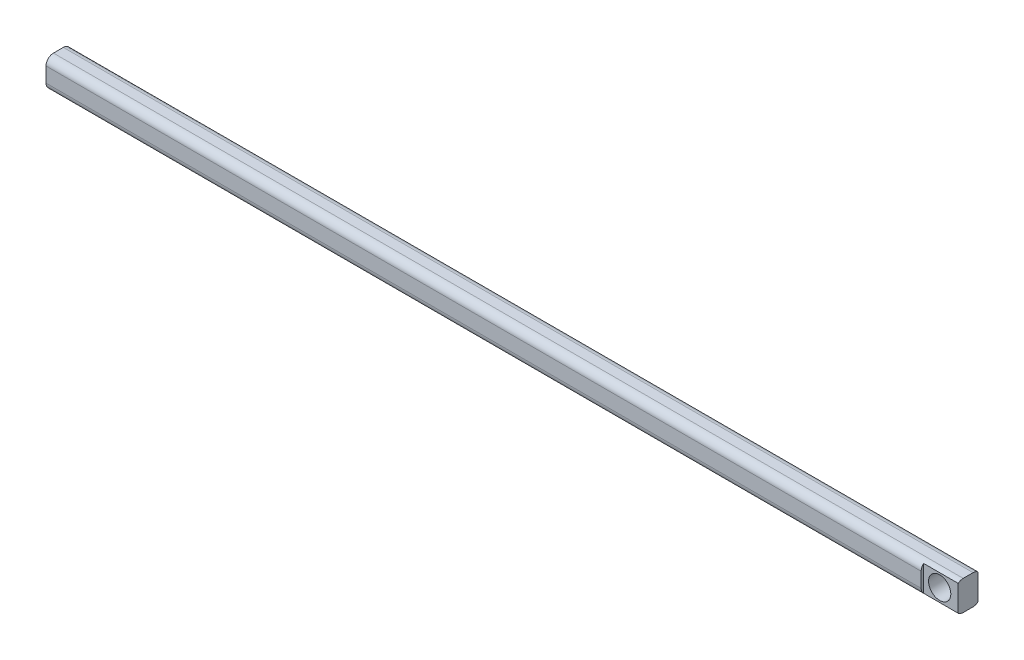
ISO-10303-21;
HEADER;
FILE_DESCRIPTION(('STEP AP214'),'2;1');
FILE_NAME('part.step','',(''),(''),'','','');
FILE_SCHEMA(('AUTOMOTIVE_DESIGN { 1 0 10303 214 1 1 1 1 }'));
ENDSEC;
DATA;
#1=APPLICATION_CONTEXT('core data for automotive mechanical design processes');
#2=APPLICATION_PROTOCOL_DEFINITION('international standard','automotive_design',2000,#1);
#3=PRODUCT_CONTEXT('',#1,'mechanical');
#4=PRODUCT('Part','Part','',(#3));
#5=PRODUCT_RELATED_PRODUCT_CATEGORY('part','',(#4));
#6=PRODUCT_DEFINITION_FORMATION('','',#4);
#7=PRODUCT_DEFINITION_CONTEXT('part definition',#1,'design');
#8=PRODUCT_DEFINITION('design','',#6,#7);
#9=PRODUCT_DEFINITION_SHAPE('','',#8);
#10=(LENGTH_UNIT() NAMED_UNIT(*) SI_UNIT(.MILLI.,.METRE.));
#11=(NAMED_UNIT(*) PLANE_ANGLE_UNIT() SI_UNIT($,.RADIAN.));
#12=(NAMED_UNIT(*) SI_UNIT($,.STERADIAN.) SOLID_ANGLE_UNIT());
#13=UNCERTAINTY_MEASURE_WITH_UNIT(LENGTH_MEASURE(1.E-05),#10,'distance_accuracy_value','');
#14=(GEOMETRIC_REPRESENTATION_CONTEXT(3) GLOBAL_UNCERTAINTY_ASSIGNED_CONTEXT((#13)) GLOBAL_UNIT_ASSIGNED_CONTEXT((#10,
#11,#12)) REPRESENTATION_CONTEXT('',''));
#15=CARTESIAN_POINT('',(0.,0.,0.));
#16=DIRECTION('',(0.,0.,1.));
#17=DIRECTION('',(1.,0.,0.));
#18=AXIS2_PLACEMENT_3D('',#15,#16,#17);
#19=CARTESIAN_POINT('',(0.,0.,12.5));
#20=DIRECTION('',(0.,0.,-1.));
#21=DIRECTION('',(-1.,0.,0.));
#22=AXIS2_PLACEMENT_3D('',#19,#20,#21);
#23=PLANE('',#22);
#24=DIRECTION('',(-1.,0.,0.));
#25=VECTOR('',#24,1.);
#26=CARTESIAN_POINT('',(0.,2.99999999999999,12.5));
#27=LINE('',#26,#25);
#28=CARTESIAN_POINT('',(57.75,2.99999999999999,12.5));
#29=VERTEX_POINT('',#28);
#30=CARTESIAN_POINT('',(-296.25,2.99999999999993,12.5));
#31=VERTEX_POINT('',#30);
#32=EDGE_CURVE('E143',#29,#31,#27,.T.);
#33=ORIENTED_EDGE('',*,*,#32,.T.);
#34=DIRECTION('',(0.,1.,0.));
#35=VECTOR('',#34,1.);
#36=CARTESIAN_POINT('',(-296.25,-3.00000000000007,12.5));
#37=LINE('',#36,#35);
#38=CARTESIAN_POINT('',(-296.25,-3.00000000000007,12.5));
#39=VERTEX_POINT('',#38);
#40=EDGE_CURVE('E146',#39,#31,#37,.T.);
#41=ORIENTED_EDGE('',*,*,#40,.F.);
#42=DIRECTION('',(1.,0.,0.));
#43=VECTOR('',#42,1.);
#44=CARTESIAN_POINT('',(0.,-3.00000000000001,12.5));
#45=LINE('',#44,#43);
#46=CARTESIAN_POINT('',(57.75,-3.,12.5));
#47=VERTEX_POINT('',#46);
#48=EDGE_CURVE('E131',#39,#47,#45,.T.);
#49=ORIENTED_EDGE('',*,*,#48,.T.);
#50=DIRECTION('',(0.,-1.,0.));
#51=VECTOR('',#50,1.);
#52=CARTESIAN_POINT('',(57.75,5.99999999999999,12.5));
#53=LINE('',#52,#51);
#54=EDGE_CURVE('E174',#29,#47,#53,.T.);
#55=ORIENTED_EDGE('',*,*,#54,.F.);
#56=EDGE_LOOP('',(#33,#41,#49,#55));
#57=FACE_BOUND('',#56,.T.);
#58=ADVANCED_FACE('F42',(#57),#23,.F.);
#59=CARTESIAN_POINT('',(0.,0.,2.5));
#60=DIRECTION('',(0.,0.,-1.));
#61=DIRECTION('',(-1.,0.,0.));
#62=AXIS2_PLACEMENT_3D('',#59,#60,#61);
#63=PLANE('',#62);
#64=DIRECTION('',(0.,1.,0.));
#65=VECTOR('',#64,1.);
#66=CARTESIAN_POINT('',(57.75,-6.,2.5));
#67=LINE('',#66,#65);
#68=CARTESIAN_POINT('',(57.75,-3.,2.5));
#69=VERTEX_POINT('',#68);
#70=CARTESIAN_POINT('',(57.75,2.99999999999999,2.5));
#71=VERTEX_POINT('',#70);
#72=EDGE_CURVE('E183',#69,#71,#67,.T.);
#73=ORIENTED_EDGE('',*,*,#72,.F.);
#74=DIRECTION('',(1.,0.,0.));
#75=VECTOR('',#74,1.);
#76=CARTESIAN_POINT('',(53.75,-3.00000000000001,2.5));
#77=LINE('',#76,#75);
#78=CARTESIAN_POINT('',(-296.25,-3.00000000000007,2.5));
#79=VERTEX_POINT('',#78);
#80=EDGE_CURVE('E228',#69,#79,#77,.F.);
#81=ORIENTED_EDGE('',*,*,#80,.T.);
#82=DIRECTION('',(0.,-1.,0.));
#83=VECTOR('',#82,1.);
#84=CARTESIAN_POINT('',(-296.25,2.99999999999993,2.5));
#85=LINE('',#84,#83);
#86=CARTESIAN_POINT('',(-296.25,2.99999999999993,2.5));
#87=VERTEX_POINT('',#86);
#88=EDGE_CURVE('E167',#87,#79,#85,.T.);
#89=ORIENTED_EDGE('',*,*,#88,.F.);
#90=DIRECTION('',(-1.,0.,0.));
#91=VECTOR('',#90,1.);
#92=CARTESIAN_POINT('',(57.75,2.99999999999999,2.5));
#93=LINE('',#92,#91);
#94=EDGE_CURVE('E57',#87,#71,#93,.F.);
#95=ORIENTED_EDGE('',*,*,#94,.T.);
#96=EDGE_LOOP('',(#73,#81,#89,#95));
#97=FACE_BOUND('',#96,.T.);
#98=ADVANCED_FACE('F262',(#97),#63,.T.);
#99=CARTESIAN_POINT('',(71.75,-6.,12.5));
#100=DIRECTION('',(0.,1.,0.));
#101=DIRECTION('',(-1.,0.,0.));
#102=AXIS2_PLACEMENT_3D('',#99,#100,#101);
#103=PLANE('',#102);
#104=DIRECTION('',(0.,0.,-1.));
#105=VECTOR('',#104,1.);
#106=CARTESIAN_POINT('',(71.75,-6.,12.5));
#107=LINE('',#106,#105);
#108=CARTESIAN_POINT('',(71.75,-6.,9.5));
#109=VERTEX_POINT('',#108);
#110=CARTESIAN_POINT('',(71.75,-6.,5.5));
#111=VERTEX_POINT('',#110);
#112=EDGE_CURVE('E192',#109,#111,#107,.T.);
#113=ORIENTED_EDGE('',*,*,#112,.F.);
#114=DIRECTION('',(1.,0.,0.));
#115=VECTOR('',#114,1.);
#116=CARTESIAN_POINT('',(71.75,-6.,9.5));
#117=LINE('',#116,#115);
#118=CARTESIAN_POINT('',(-296.25,-6.00000000000007,9.5));
#119=VERTEX_POINT('',#118);
#120=EDGE_CURVE('E218',#109,#119,#117,.F.);
#121=ORIENTED_EDGE('',*,*,#120,.T.);
#122=DIRECTION('',(0.,0.,1.));
#123=VECTOR('',#122,1.);
#124=CARTESIAN_POINT('',(-296.25,-6.00000000000007,5.5));
#125=LINE('',#124,#123);
#126=CARTESIAN_POINT('',(-296.25,-6.00000000000007,5.5));
#127=VERTEX_POINT('',#126);
#128=EDGE_CURVE('E157',#127,#119,#125,.T.);
#129=ORIENTED_EDGE('',*,*,#128,.F.);
#130=DIRECTION('',(1.,0.,0.));
#131=VECTOR('',#130,1.);
#132=CARTESIAN_POINT('',(57.75,-6.00000000000001,5.5));
#133=LINE('',#132,#131);
#134=EDGE_CURVE('E215',#127,#111,#133,.T.);
#135=ORIENTED_EDGE('',*,*,#134,.T.);
#136=EDGE_LOOP('',(#113,#121,#129,#135));
#137=FACE_BOUND('',#136,.T.);
#138=ADVANCED_FACE('F265',(#137),#103,.F.);
#139=CARTESIAN_POINT('',(71.75,5.99999999999999,12.5));
#140=DIRECTION('',(-1.,0.,0.));
#141=DIRECTION('',(0.,0.,1.));
#142=AXIS2_PLACEMENT_3D('',#139,#140,#141);
#143=PLANE('',#142);
#144=DIRECTION('',(0.,1.,0.));
#145=VECTOR('',#144,1.);
#146=CARTESIAN_POINT('',(71.75,5.99999999999999,11.5));
#147=LINE('',#146,#145);
#148=CARTESIAN_POINT('',(71.75,-5.2360679774998,11.5));
#149=VERTEX_POINT('',#148);
#150=CARTESIAN_POINT('',(71.75,5.23606797749979,11.5));
#151=VERTEX_POINT('',#150);
#152=EDGE_CURVE('E177',#149,#151,#147,.T.);
#153=ORIENTED_EDGE('',*,*,#152,.F.);
#154=CARTESIAN_POINT('',(71.75,-3.,9.5));
#155=DIRECTION('',(-1.,0.,0.));
#156=DIRECTION('',(0.,0.,1.));
#157=AXIS2_PLACEMENT_3D('',#154,#155,#156);
#158=CIRCLE('',#157,3.);
#159=EDGE_CURVE('E213',#149,#109,#158,.F.);
#160=ORIENTED_EDGE('',*,*,#159,.T.);
#161=ORIENTED_EDGE('',*,*,#112,.T.);
#162=CARTESIAN_POINT('',(71.75,-3.,5.5));
#163=DIRECTION('',(-1.,0.,0.));
#164=DIRECTION('',(0.,0.,1.));
#165=AXIS2_PLACEMENT_3D('',#162,#163,#164);
#166=CIRCLE('',#165,3.);
#167=CARTESIAN_POINT('',(71.75,-5.23606797749979,3.5));
#168=VERTEX_POINT('',#167);
#169=EDGE_CURVE('E211',#111,#168,#166,.F.);
#170=ORIENTED_EDGE('',*,*,#169,.T.);
#171=DIRECTION('',(0.,-1.,0.));
#172=VECTOR('',#171,1.);
#173=CARTESIAN_POINT('',(71.75,5.99999999999999,3.5));
#174=LINE('',#173,#172);
#175=CARTESIAN_POINT('',(71.75,5.23606797749978,3.5));
#176=VERTEX_POINT('',#175);
#177=EDGE_CURVE('E173',#176,#168,#174,.T.);
#178=ORIENTED_EDGE('',*,*,#177,.F.);
#179=CARTESIAN_POINT('',(71.75,2.99999999999999,5.5));
#180=DIRECTION('',(-1.,0.,0.));
#181=DIRECTION('',(0.,0.,1.));
#182=AXIS2_PLACEMENT_3D('',#179,#180,#181);
#183=CIRCLE('',#182,3.);
#184=CARTESIAN_POINT('',(71.75,5.99999999999999,5.5));
#185=VERTEX_POINT('',#184);
#186=EDGE_CURVE('E209',#176,#185,#183,.F.);
#187=ORIENTED_EDGE('',*,*,#186,.T.);
#188=DIRECTION('',(0.,0.,-1.));
#189=VECTOR('',#188,1.);
#190=CARTESIAN_POINT('',(71.75,5.99999999999999,12.5));
#191=LINE('',#190,#189);
#192=CARTESIAN_POINT('',(71.75,5.99999999999999,9.5));
#193=VERTEX_POINT('',#192);
#194=EDGE_CURVE('E189',#193,#185,#191,.T.);
#195=ORIENTED_EDGE('',*,*,#194,.F.);
#196=CARTESIAN_POINT('',(71.75,2.99999999999999,9.5));
#197=DIRECTION('',(-1.,0.,0.));
#198=DIRECTION('',(0.,0.,1.));
#199=AXIS2_PLACEMENT_3D('',#196,#197,#198);
#200=CIRCLE('',#199,3.);
#201=EDGE_CURVE('E207',#193,#151,#200,.F.);
#202=ORIENTED_EDGE('',*,*,#201,.T.);
#203=EDGE_LOOP('',(#153,#160,#161,#170,#178,#187,#195,#202));
#204=FACE_BOUND('',#203,.T.);
#205=ADVANCED_FACE('F238',(#204),#143,.F.);
#206=CARTESIAN_POINT('',(53.75,5.99999999999999,12.5));
#207=DIRECTION('',(0.,-1.,0.));
#208=DIRECTION('',(0.,0.,-1.));
#209=AXIS2_PLACEMENT_3D('',#206,#207,#208);
#210=PLANE('',#209);
#211=ORIENTED_EDGE('',*,*,#194,.T.);
#212=DIRECTION('',(-1.,0.,0.));
#213=VECTOR('',#212,1.);
#214=CARTESIAN_POINT('',(53.75,5.99999999999999,5.5));
#215=LINE('',#214,#213);
#216=CARTESIAN_POINT('',(-296.25,5.99999999999993,5.5));
#217=VERTEX_POINT('',#216);
#218=EDGE_CURVE('E12',#185,#217,#215,.T.);
#219=ORIENTED_EDGE('',*,*,#218,.T.);
#220=DIRECTION('',(0.,0.,-1.));
#221=VECTOR('',#220,1.);
#222=CARTESIAN_POINT('',(-296.25,5.99999999999993,9.5));
#223=LINE('',#222,#221);
#224=CARTESIAN_POINT('',(-296.25,5.99999999999993,9.5));
#225=VERTEX_POINT('',#224);
#226=EDGE_CURVE('E161',#225,#217,#223,.T.);
#227=ORIENTED_EDGE('',*,*,#226,.F.);
#228=DIRECTION('',(-1.,0.,0.));
#229=VECTOR('',#228,1.);
#230=CARTESIAN_POINT('',(53.75,5.99999999999999,9.5));
#231=LINE('',#230,#229);
#232=EDGE_CURVE('E50',#225,#193,#231,.F.);
#233=ORIENTED_EDGE('',*,*,#232,.T.);
#234=EDGE_LOOP('',(#211,#219,#227,#233));
#235=FACE_BOUND('',#234,.T.);
#236=ADVANCED_FACE('F232',(#235),#210,.F.);
#237=CARTESIAN_POINT('',(57.75,5.99999999999999,3.5));
#238=DIRECTION('',(0.,0.,1.));
#239=DIRECTION('',(0.,-1.,0.));
#240=AXIS2_PLACEMENT_3D('',#237,#238,#239);
#241=PLANE('',#240);
#242=CARTESIAN_POINT('',(64.25,0.,3.5));
#243=DIRECTION('',(0.,0.,1.));
#244=DIRECTION('',(0.,-1.,0.));
#245=AXIS2_PLACEMENT_3D('',#242,#243,#244);
#246=CIRCLE('',#245,4.5);
#247=CARTESIAN_POINT('',(64.25,-4.5,3.5));
#248=VERTEX_POINT('',#247);
#249=EDGE_CURVE('E180',#248,#248,#246,.T.);
#250=ORIENTED_EDGE('',*,*,#249,.T.);
#251=EDGE_LOOP('',(#250));
#252=FACE_BOUND('',#251,.T.);
#253=ORIENTED_EDGE('',*,*,#177,.T.);
#254=DIRECTION('',(-1.,0.,0.));
#255=VECTOR('',#254,1.);
#256=CARTESIAN_POINT('',(71.75,-5.23606797749979,3.5));
#257=LINE('',#256,#255);
#258=CARTESIAN_POINT('',(57.75,-5.23606797749979,3.5));
#259=VERTEX_POINT('',#258);
#260=EDGE_CURVE('E222',#168,#259,#257,.T.);
#261=ORIENTED_EDGE('',*,*,#260,.T.);
#262=DIRECTION('',(0.,-1.,0.));
#263=VECTOR('',#262,1.);
#264=CARTESIAN_POINT('',(57.75,5.99999999999999,3.5));
#265=LINE('',#264,#263);
#266=CARTESIAN_POINT('',(57.75,5.23606797749978,3.5));
#267=VERTEX_POINT('',#266);
#268=EDGE_CURVE('E184',#267,#259,#265,.T.);
#269=ORIENTED_EDGE('',*,*,#268,.F.);
#270=DIRECTION('',(1.,0.,0.));
#271=VECTOR('',#270,1.);
#272=CARTESIAN_POINT('',(57.75,5.23606797749978,3.5));
#273=LINE('',#272,#271);
#274=EDGE_CURVE('E220',#267,#176,#273,.T.);
#275=ORIENTED_EDGE('',*,*,#274,.T.);
#276=EDGE_LOOP('',(#253,#261,#269,#275));
#277=FACE_BOUND('',#276,.T.);
#278=ADVANCED_FACE('F256',(#252,#277),#241,.F.);
#279=CARTESIAN_POINT('',(57.75,0.,0.));
#280=DIRECTION('',(1.,0.,0.));
#281=DIRECTION('',(0.,0.,-1.));
#282=AXIS2_PLACEMENT_3D('',#279,#280,#281);
#283=PLANE('',#282);
#284=ORIENTED_EDGE('',*,*,#268,.T.);
#285=CARTESIAN_POINT('',(57.75,-3.,5.5));
#286=DIRECTION('',(1.,0.,0.));
#287=DIRECTION('',(0.,0.,-1.));
#288=AXIS2_PLACEMENT_3D('',#285,#286,#287);
#289=CIRCLE('',#288,3.);
#290=EDGE_CURVE('E64',#259,#69,#289,.T.);
#291=ORIENTED_EDGE('',*,*,#290,.T.);
#292=ORIENTED_EDGE('',*,*,#72,.T.);
#293=CARTESIAN_POINT('',(57.75,2.99999999999999,5.5));
#294=DIRECTION('',(1.,0.,0.));
#295=DIRECTION('',(0.,0.,-1.));
#296=AXIS2_PLACEMENT_3D('',#293,#294,#295);
#297=CIRCLE('',#296,3.);
#298=EDGE_CURVE('E224',#71,#267,#297,.T.);
#299=ORIENTED_EDGE('',*,*,#298,.T.);
#300=EDGE_LOOP('',(#284,#291,#292,#299));
#301=FACE_BOUND('',#300,.T.);
#302=ADVANCED_FACE('F254',(#301),#283,.T.);
#303=CARTESIAN_POINT('',(57.75,5.99999999999999,11.5));
#304=DIRECTION('',(0.,0.,-1.));
#305=DIRECTION('',(0.,1.,0.));
#306=AXIS2_PLACEMENT_3D('',#303,#304,#305);
#307=PLANE('',#306);
#308=CARTESIAN_POINT('',(64.25,0.,11.5));
#309=DIRECTION('',(0.,0.,-1.));
#310=DIRECTION('',(0.,1.,0.));
#311=AXIS2_PLACEMENT_3D('',#308,#309,#310);
#312=CIRCLE('',#311,4.5);
#313=CARTESIAN_POINT('',(64.25,4.5,11.5));
#314=VERTEX_POINT('',#313);
#315=EDGE_CURVE('E193',#314,#314,#312,.T.);
#316=ORIENTED_EDGE('',*,*,#315,.T.);
#317=EDGE_LOOP('',(#316));
#318=FACE_BOUND('',#317,.T.);
#319=DIRECTION('',(0.,1.,0.));
#320=VECTOR('',#319,1.);
#321=CARTESIAN_POINT('',(57.75,5.99999999999999,11.5));
#322=LINE('',#321,#320);
#323=CARTESIAN_POINT('',(57.75,-5.2360679774998,11.5));
#324=VERTEX_POINT('',#323);
#325=CARTESIAN_POINT('',(57.75,5.23606797749979,11.5));
#326=VERTEX_POINT('',#325);
#327=EDGE_CURVE('E176',#324,#326,#322,.T.);
#328=ORIENTED_EDGE('',*,*,#327,.F.);
#329=DIRECTION('',(1.,0.,0.));
#330=VECTOR('',#329,1.);
#331=CARTESIAN_POINT('',(57.75,-5.2360679774998,11.5));
#332=LINE('',#331,#330);
#333=EDGE_CURVE('E205',#324,#149,#332,.T.);
#334=ORIENTED_EDGE('',*,*,#333,.T.);
#335=ORIENTED_EDGE('',*,*,#152,.T.);
#336=DIRECTION('',(-1.,0.,0.));
#337=VECTOR('',#336,1.);
#338=CARTESIAN_POINT('',(71.75,5.23606797749979,11.5));
#339=LINE('',#338,#337);
#340=EDGE_CURVE('E203',#151,#326,#339,.T.);
#341=ORIENTED_EDGE('',*,*,#340,.T.);
#342=EDGE_LOOP('',(#328,#334,#335,#341));
#343=FACE_BOUND('',#342,.T.);
#344=ADVANCED_FACE('F245',(#318,#343),#307,.F.);
#345=CARTESIAN_POINT('',(57.75,0.,0.));
#346=DIRECTION('',(1.,0.,0.));
#347=DIRECTION('',(0.,0.,-1.));
#348=AXIS2_PLACEMENT_3D('',#345,#346,#347);
#349=PLANE('',#348);
#350=ORIENTED_EDGE('',*,*,#54,.T.);
#351=CARTESIAN_POINT('',(57.75,-3.,9.5));
#352=DIRECTION('',(1.,0.,0.));
#353=DIRECTION('',(0.,0.,-1.));
#354=AXIS2_PLACEMENT_3D('',#351,#352,#353);
#355=CIRCLE('',#354,3.);
#356=EDGE_CURVE('E138',#47,#324,#355,.T.);
#357=ORIENTED_EDGE('',*,*,#356,.T.);
#358=ORIENTED_EDGE('',*,*,#327,.T.);
#359=CARTESIAN_POINT('',(57.75,2.99999999999999,9.5));
#360=DIRECTION('',(1.,0.,0.));
#361=DIRECTION('',(0.,0.,-1.));
#362=AXIS2_PLACEMENT_3D('',#359,#360,#361);
#363=CIRCLE('',#362,3.);
#364=EDGE_CURVE('E142',#326,#29,#363,.T.);
#365=ORIENTED_EDGE('',*,*,#364,.T.);
#366=EDGE_LOOP('',(#350,#357,#358,#365));
#367=FACE_BOUND('',#366,.T.);
#368=ADVANCED_FACE('F247',(#367),#349,.T.);
#369=CARTESIAN_POINT('',(64.25,0.,12.5));
#370=DIRECTION('',(0.,0.,-1.));
#371=DIRECTION('',(-1.,0.,0.));
#372=AXIS2_PLACEMENT_3D('',#369,#370,#371);
#373=CYLINDRICAL_SURFACE('',#372,4.5);
#374=ORIENTED_EDGE('',*,*,#315,.F.);
#375=EDGE_LOOP('',(#374));
#376=FACE_BOUND('',#375,.T.);
#377=ORIENTED_EDGE('',*,*,#249,.F.);
#378=EDGE_LOOP('',(#377));
#379=FACE_BOUND('',#378,.T.);
#380=ADVANCED_FACE('F281',(#376,#379),#373,.F.);
#381=CARTESIAN_POINT('',(0.,-3.00000000000001,9.5));
#382=DIRECTION('',(1.,0.,0.));
#383=DIRECTION('',(0.,1.,0.));
#384=AXIS2_PLACEMENT_3D('',#381,#382,#383);
#385=CYLINDRICAL_SURFACE('',#384,3.);
#386=ORIENTED_EDGE('',*,*,#48,.F.);
#387=CARTESIAN_POINT('',(-296.25,-3.00000000000007,9.5));
#388=DIRECTION('',(-1.,0.,0.));
#389=DIRECTION('',(0.,-1.,0.));
#390=AXIS2_PLACEMENT_3D('',#387,#388,#389);
#391=CIRCLE('',#390,3.);
#392=EDGE_CURVE('E136',#119,#39,#391,.T.);
#393=ORIENTED_EDGE('',*,*,#392,.F.);
#394=ORIENTED_EDGE('',*,*,#120,.F.);
#395=ORIENTED_EDGE('',*,*,#159,.F.);
#396=ORIENTED_EDGE('',*,*,#333,.F.);
#397=ORIENTED_EDGE('',*,*,#356,.F.);
#398=EDGE_LOOP('',(#386,#393,#394,#395,#396,#397));
#399=FACE_BOUND('',#398,.T.);
#400=ADVANCED_FACE('F133',(#399),#385,.T.);
#401=CARTESIAN_POINT('',(71.75,-3.,5.5));
#402=DIRECTION('',(-1.,0.,0.));
#403=DIRECTION('',(0.,-1.,0.));
#404=AXIS2_PLACEMENT_3D('',#401,#402,#403);
#405=CYLINDRICAL_SURFACE('',#404,3.);
#406=ORIENTED_EDGE('',*,*,#134,.F.);
#407=CARTESIAN_POINT('',(-296.25,-3.00000000000007,5.5));
#408=DIRECTION('',(-1.,0.,0.));
#409=DIRECTION('',(0.,-1.,0.));
#410=AXIS2_PLACEMENT_3D('',#407,#408,#409);
#411=CIRCLE('',#410,3.);
#412=EDGE_CURVE('E170',#79,#127,#411,.T.);
#413=ORIENTED_EDGE('',*,*,#412,.F.);
#414=ORIENTED_EDGE('',*,*,#80,.F.);
#415=ORIENTED_EDGE('',*,*,#290,.F.);
#416=ORIENTED_EDGE('',*,*,#260,.F.);
#417=ORIENTED_EDGE('',*,*,#169,.F.);
#418=EDGE_LOOP('',(#406,#413,#414,#415,#416,#417));
#419=FACE_BOUND('',#418,.T.);
#420=ADVANCED_FACE('F259',(#419),#405,.T.);
#421=CARTESIAN_POINT('',(53.75,2.99999999999999,5.5));
#422=DIRECTION('',(1.,0.,0.));
#423=DIRECTION('',(0.,0.,-1.));
#424=AXIS2_PLACEMENT_3D('',#421,#422,#423);
#425=CYLINDRICAL_SURFACE('',#424,3.);
#426=ORIENTED_EDGE('',*,*,#298,.F.);
#427=ORIENTED_EDGE('',*,*,#94,.F.);
#428=CARTESIAN_POINT('',(-296.25,2.99999999999993,5.5));
#429=DIRECTION('',(-1.,0.,0.));
#430=DIRECTION('',(0.,-1.,0.));
#431=AXIS2_PLACEMENT_3D('',#428,#429,#430);
#432=CIRCLE('',#431,3.);
#433=EDGE_CURVE('E164',#217,#87,#432,.T.);
#434=ORIENTED_EDGE('',*,*,#433,.F.);
#435=ORIENTED_EDGE('',*,*,#218,.F.);
#436=ORIENTED_EDGE('',*,*,#186,.F.);
#437=ORIENTED_EDGE('',*,*,#274,.F.);
#438=EDGE_LOOP('',(#426,#427,#434,#435,#436,#437));
#439=FACE_BOUND('',#438,.T.);
#440=ADVANCED_FACE('F251',(#439),#425,.T.);
#441=CARTESIAN_POINT('',(0.,2.99999999999999,9.5));
#442=DIRECTION('',(-1.,0.,0.));
#443=DIRECTION('',(0.,0.,1.));
#444=AXIS2_PLACEMENT_3D('',#441,#442,#443);
#445=CYLINDRICAL_SURFACE('',#444,3.);
#446=ORIENTED_EDGE('',*,*,#201,.F.);
#447=ORIENTED_EDGE('',*,*,#232,.F.);
#448=CARTESIAN_POINT('',(-296.25,2.99999999999993,9.5));
#449=DIRECTION('',(-1.,0.,0.));
#450=DIRECTION('',(0.,-1.,0.));
#451=AXIS2_PLACEMENT_3D('',#448,#449,#450);
#452=CIRCLE('',#451,3.);
#453=EDGE_CURVE('E151',#31,#225,#452,.T.);
#454=ORIENTED_EDGE('',*,*,#453,.F.);
#455=ORIENTED_EDGE('',*,*,#32,.F.);
#456=ORIENTED_EDGE('',*,*,#364,.F.);
#457=ORIENTED_EDGE('',*,*,#340,.F.);
#458=EDGE_LOOP('',(#446,#447,#454,#455,#456,#457));
#459=FACE_BOUND('',#458,.T.);
#460=ADVANCED_FACE('F44',(#459),#445,.T.);
#461=CARTESIAN_POINT('',(-296.25,-3.00000000000007,9.5));
#462=DIRECTION('',(-1.,0.,0.));
#463=DIRECTION('',(0.,-1.,0.));
#464=AXIS2_PLACEMENT_3D('',#461,#462,#463);
#465=PLANE('',#464);
#466=ORIENTED_EDGE('',*,*,#392,.T.);
#467=ORIENTED_EDGE('',*,*,#40,.T.);
#468=ORIENTED_EDGE('',*,*,#453,.T.);
#469=ORIENTED_EDGE('',*,*,#226,.T.);
#470=ORIENTED_EDGE('',*,*,#433,.T.);
#471=ORIENTED_EDGE('',*,*,#88,.T.);
#472=ORIENTED_EDGE('',*,*,#412,.T.);
#473=ORIENTED_EDGE('',*,*,#128,.T.);
#474=EDGE_LOOP('',(#466,#467,#468,#469,#470,#471,#472,#473));
#475=FACE_BOUND('',#474,.T.);
#476=ADVANCED_FACE('F154',(#475),#465,.T.);
#477=CLOSED_SHELL('',(#58,#98,#138,#205,#236,#278,#302,#344,#368,#380,#400,#420,#440,#460,#476));
#478=MANIFOLD_SOLID_BREP('B2',#477);
#479=ADVANCED_BREP_SHAPE_REPRESENTATION('',(#18,#478),#14);
#480=SHAPE_DEFINITION_REPRESENTATION(#9,#479);
ENDSEC;
END-ISO-10303-21;
